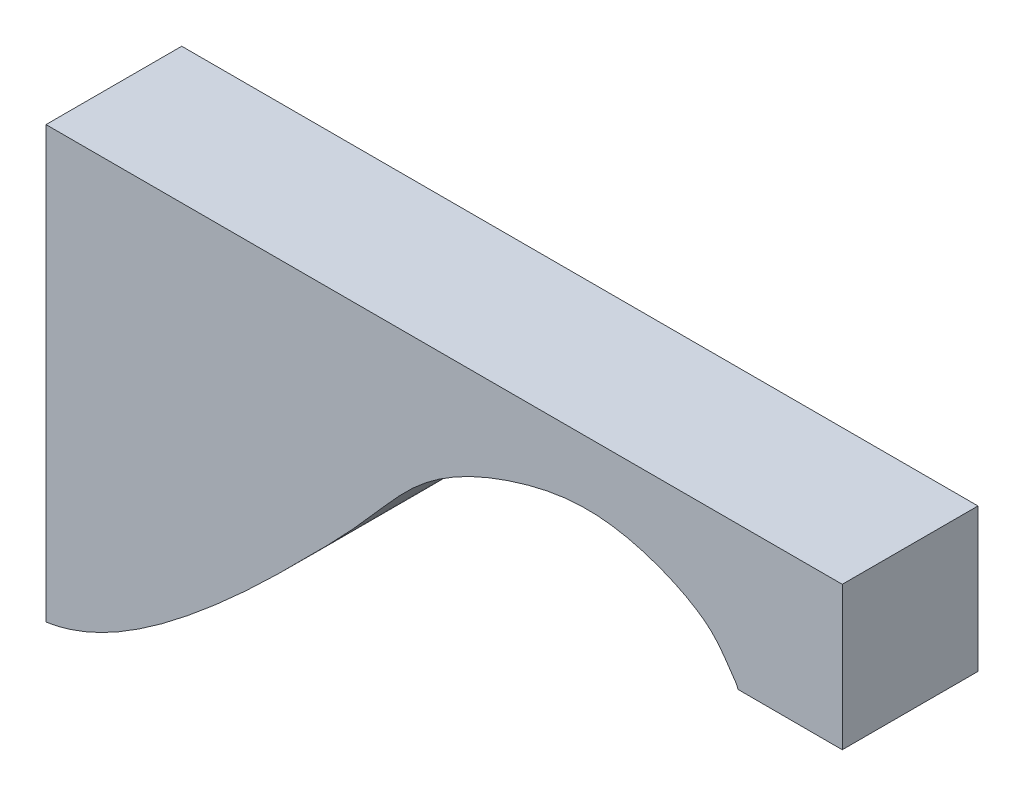
ISO-10303-21;
HEADER;
FILE_DESCRIPTION(('STEP AP214'),'2;1');
FILE_NAME('part.step','',(''),(''),'','','');
FILE_SCHEMA(('AUTOMOTIVE_DESIGN { 1 0 10303 214 1 1 1 1 }'));
ENDSEC;
DATA;
#1=APPLICATION_CONTEXT('core data for automotive mechanical design processes');
#2=APPLICATION_PROTOCOL_DEFINITION('international standard','automotive_design',2000,#1);
#3=PRODUCT_CONTEXT('',#1,'mechanical');
#4=PRODUCT('Part','Part','',(#3));
#5=PRODUCT_RELATED_PRODUCT_CATEGORY('part','',(#4));
#6=PRODUCT_DEFINITION_FORMATION('','',#4);
#7=PRODUCT_DEFINITION_CONTEXT('part definition',#1,'design');
#8=PRODUCT_DEFINITION('design','',#6,#7);
#9=PRODUCT_DEFINITION_SHAPE('','',#8);
#10=(LENGTH_UNIT() NAMED_UNIT(*) SI_UNIT(.MILLI.,.METRE.));
#11=(NAMED_UNIT(*) PLANE_ANGLE_UNIT() SI_UNIT($,.RADIAN.));
#12=(NAMED_UNIT(*) SI_UNIT($,.STERADIAN.) SOLID_ANGLE_UNIT());
#13=UNCERTAINTY_MEASURE_WITH_UNIT(LENGTH_MEASURE(1.E-05),#10,'distance_accuracy_value','');
#14=(GEOMETRIC_REPRESENTATION_CONTEXT(3) GLOBAL_UNCERTAINTY_ASSIGNED_CONTEXT((#13)) GLOBAL_UNIT_ASSIGNED_CONTEXT((#10,
#11,#12)) REPRESENTATION_CONTEXT('',''));
#15=CARTESIAN_POINT('',(0.,0.,0.));
#16=DIRECTION('',(0.,0.,1.));
#17=DIRECTION('',(1.,0.,0.));
#18=AXIS2_PLACEMENT_3D('',#15,#16,#17);
#19=CARTESIAN_POINT('',(56.7695329292914,-23.1398140505859,51.9999999999997));
#20=CARTESIAN_POINT('',(57.285979180506,-23.0612984873367,51.9999999999997));
#21=CARTESIAN_POINT('',(57.7906917341034,-22.9342691366003,51.9999999999997));
#22=CARTESIAN_POINT('',(58.7824079382154,-22.6069917457751,51.9999999999997));
#23=CARTESIAN_POINT('',(59.2715610868895,-22.4055647360326,51.9999999999997));
#24=CARTESIAN_POINT('',(60.6869454004047,-21.7365585192576,51.9999999999997));
#25=CARTESIAN_POINT('',(61.5748041033021,-21.2039869995168,51.9999999999997));
#26=CARTESIAN_POINT('',(63.2942881326894,-20.0514959881764,51.9999999999997));
#27=CARTESIAN_POINT('',(64.1245852304651,-19.4295133431301,51.9999999999997));
#28=CARTESIAN_POINT('',(65.7502012791893,-18.1312160818861,51.9999999999997));
#29=CARTESIAN_POINT('',(66.5441949692823,-17.4560278179111,51.9999999999997));
#30=CARTESIAN_POINT('',(68.100406160835,-16.0757732473001,51.9999999999997));
#31=CARTESIAN_POINT('',(68.863487129066,-15.3693388996823,51.9999999999997));
#32=CARTESIAN_POINT('',(70.3651483770034,-13.9298782471244,51.9999999999997));
#33=CARTESIAN_POINT('',(71.1041151974862,-13.1971682467196,51.9999999999997));
#34=CARTESIAN_POINT('',(72.5741182753382,-11.7235894049574,51.9999999999997));
#35=CARTESIAN_POINT('',(73.3073110471058,-10.9850694251836,51.9999999999997));
#36=CARTESIAN_POINT('',(74.3858546370538,-9.85696251296961,51.9999999999997));
#37=CARTESIAN_POINT('',(74.7413987118715,-9.47712809667723,51.9999999999997));
#38=CARTESIAN_POINT('',(75.4413970209349,-8.7068489308984,51.9999999999997));
#39=CARTESIAN_POINT('',(75.7846823209215,-8.3153028691134,51.9999999999997));
#40=CARTESIAN_POINT('',(76.4698718056331,-7.5304405907173,51.9999999999997));
#41=CARTESIAN_POINT('',(76.811845283095,-7.13734287767223,51.9999999999997));
#42=CARTESIAN_POINT('',(77.509783641773,-6.36615925076295,51.9999999999997));
#43=CARTESIAN_POINT('',(77.8653080005757,-5.98760068711172,51.9999999999997));
#44=CARTESIAN_POINT('',(78.615212628577,-5.27217323827879,51.9999999999997));
#45=CARTESIAN_POINT('',(79.0097185899976,-4.93543921207415,51.9999999999997));
#46=CARTESIAN_POINT('',(79.8430453630222,-4.30951789931776,51.9999999999997));
#47=CARTESIAN_POINT('',(80.2830269569935,-4.01962258671459,51.9999999999997));
#48=CARTESIAN_POINT('',(81.6584729758453,-3.22184863800179,51.9999999999997));
#49=CARTESIAN_POINT('',(82.6165952164924,-2.79714695233828,51.9999999999997));
#50=CARTESIAN_POINT('',(84.0943450583755,-2.26570153619637,51.9999999999997));
#51=CARTESIAN_POINT('',(84.5937610776078,-2.10634079868381,51.9999999999997));
#52=CARTESIAN_POINT('',(85.6073944820156,-1.82615186286361,51.9999999999997));
#53=CARTESIAN_POINT('',(86.1250576878099,-1.7058708877309,51.9999999999997));
#54=CARTESIAN_POINT('',(87.1628454557626,-1.52679968085252,51.9999999999997));
#55=CARTESIAN_POINT('',(87.6832540944095,-1.46763494736214,51.9999999999997));
#56=CARTESIAN_POINT('',(88.7277672876193,-1.42340868917566,51.9999999999997));
#57=CARTESIAN_POINT('',(89.2519096915891,-1.43910604605879,51.9999999999997));
#58=CARTESIAN_POINT('',(90.0411227223575,-1.52279062573416,51.9999999999997));
#59=CARTESIAN_POINT('',(90.304870485113,-1.56047638372769,51.9999999999997));
#60=CARTESIAN_POINT('',(90.8252187981371,-1.6524229929864,51.9999999999997));
#61=CARTESIAN_POINT('',(91.082900662301,-1.70674496130816,51.9999999999997));
#62=CARTESIAN_POINT('',(91.8492054529693,-1.89229115766123,51.9999999999997));
#63=CARTESIAN_POINT('',(92.3511326120563,-2.04594482113714,51.9999999999997));
#64=CARTESIAN_POINT('',(93.3380663288029,-2.40993266187414,51.9999999999997));
#65=CARTESIAN_POINT('',(93.826746040114,-2.61961044580516,51.9999999999997));
#66=CARTESIAN_POINT('',(94.5306680997257,-2.98572934969667,51.9999999999997));
#67=CARTESIAN_POINT('',(94.7603840317825,-3.11553775232475,51.9999999999997));
#68=CARTESIAN_POINT('',(95.2090855200292,-3.39208165536228,51.9999999999997));
#69=CARTESIAN_POINT('',(95.4274347302452,-3.53982098738524,51.9999999999997));
#70=CARTESIAN_POINT('',(95.8446604242783,-3.86601775002373,51.9999999999997));
#71=CARTESIAN_POINT('',(96.0440735507371,-4.04708380208348,51.9999999999997));
#72=CARTESIAN_POINT('',(96.4009155406048,-4.43749852406963,51.9999999999997));
#73=CARTESIAN_POINT('',(96.5609242955925,-4.64701213226887,51.9999999999997));
#74=CARTESIAN_POINT('',(96.8706178134624,-5.07406105507819,51.9999999999997));
#75=CARTESIAN_POINT('',(97.0196620781373,-5.2920940345959,51.9999999999997));
#76=CARTESIAN_POINT('',(97.2482037889488,-5.61527770213673,51.9999999999997));
#77=CARTESIAN_POINT('',(97.3245295361561,-5.72289278933567,51.9999999999997));
#78=CARTESIAN_POINT('',(97.4644226118136,-5.94803621129245,51.9999999999997));
#79=CARTESIAN_POINT('',(97.5231594866917,-6.06343037465567,51.9999999999997));
#80=CARTESIAN_POINT('',(97.5629347464635,-6.1835749360432,51.9999999999997));
#81=B_SPLINE_CURVE_WITH_KNOTS('',3,(#19,#20,#21,#22,#23,#24,#25,#26,#27,#28,#29,#30,#31,#32,#33,
#34,#35,#36,#37,#38,#39,#40,#41,#42,#43,#44,#45,#46,#47,#48,#49,#50,#51,#52,#53,#54,#55,#56,#57,
#58,#59,#60,#61,#62,#63,#64,#65,#66,#67,#68,#69,#70,#71,#72,#73,#74,#75,#76,#77,#78,#79,#80),
.UNSPECIFIED.,.F.,.F.,(4,2,2,2,2,2,2,2,2,2,2,2,2,2,2,2,2,2,2,2,2,2,2,2,2,2,2,2,2,2,4),(0.,
0.0312500000000001,0.0625000000000002,0.125,0.1875,0.250000000000001,0.312500000000001,
0.375000000000001,0.437500000000001,0.468750000000001,0.500000000000001,0.531250000000001,
0.562500000000001,0.593750000000001,0.625000000000001,0.687500000000001,0.718750000000002,
0.750000000000002,0.781250000000003,0.812500000000003,0.828125000000003,0.843750000000003,
0.875000000000003,0.906250000000003,0.921875000000002,0.937500000000002,0.953125000000001,
0.968750000000001,0.984375,0.9921875,1.),.UNSPECIFIED.);
#82=DIRECTION('',(0.,0.,1.));
#83=VECTOR('',#82,1.);
#84=SURFACE_OF_LINEAR_EXTRUSION('',#81,#83);
#85=CARTESIAN_POINT('',(97.5629347464635,-6.1835749360432,59.9999999999997));
#86=CARTESIAN_POINT('',(97.5231594866917,-6.06343037465567,59.9999999999997));
#87=CARTESIAN_POINT('',(97.4644226118136,-5.94803621129245,59.9999999999997));
#88=CARTESIAN_POINT('',(97.3245295361561,-5.72289278933567,59.9999999999997));
#89=CARTESIAN_POINT('',(97.2482037889488,-5.61527770213673,59.9999999999997));
#90=CARTESIAN_POINT('',(97.0196620781373,-5.2920940345959,59.9999999999997));
#91=CARTESIAN_POINT('',(96.8706178134624,-5.07406105507819,59.9999999999997));
#92=CARTESIAN_POINT('',(96.5609242955925,-4.64701213226887,59.9999999999997));
#93=CARTESIAN_POINT('',(96.4009155406048,-4.43749852406963,59.9999999999997));
#94=CARTESIAN_POINT('',(96.0440735507371,-4.04708380208348,59.9999999999997));
#95=CARTESIAN_POINT('',(95.8446604242783,-3.86601775002373,59.9999999999997));
#96=CARTESIAN_POINT('',(95.4274347302452,-3.53982098738524,59.9999999999997));
#97=CARTESIAN_POINT('',(95.2090855200292,-3.39208165536228,59.9999999999997));
#98=CARTESIAN_POINT('',(94.7603840317825,-3.11553775232475,59.9999999999997));
#99=CARTESIAN_POINT('',(94.5306680997257,-2.98572934969667,59.9999999999997));
#100=CARTESIAN_POINT('',(93.826746040114,-2.61961044580516,59.9999999999997));
#101=CARTESIAN_POINT('',(93.3380663288029,-2.40993266187414,59.9999999999997));
#102=CARTESIAN_POINT('',(92.3511326120563,-2.04594482113714,59.9999999999997));
#103=CARTESIAN_POINT('',(91.8492054529693,-1.89229115766123,59.9999999999997));
#104=CARTESIAN_POINT('',(91.082900662301,-1.70674496130816,59.9999999999997));
#105=CARTESIAN_POINT('',(90.8252187981371,-1.6524229929864,59.9999999999997));
#106=CARTESIAN_POINT('',(90.304870485113,-1.56047638372769,59.9999999999997));
#107=CARTESIAN_POINT('',(90.0411227223575,-1.52279062573416,59.9999999999997));
#108=CARTESIAN_POINT('',(89.2519096915891,-1.43910604605879,59.9999999999997));
#109=CARTESIAN_POINT('',(88.7277672876193,-1.42340868917566,59.9999999999997));
#110=CARTESIAN_POINT('',(87.6832540944095,-1.46763494736214,59.9999999999997));
#111=CARTESIAN_POINT('',(87.1628454557626,-1.52679968085252,59.9999999999997));
#112=CARTESIAN_POINT('',(86.1250576878099,-1.7058708877309,59.9999999999997));
#113=CARTESIAN_POINT('',(85.6073944820156,-1.82615186286361,59.9999999999997));
#114=CARTESIAN_POINT('',(84.5937610776078,-2.10634079868381,59.9999999999997));
#115=CARTESIAN_POINT('',(84.0943450583755,-2.26570153619637,59.9999999999997));
#116=CARTESIAN_POINT('',(82.6165952164924,-2.79714695233828,59.9999999999997));
#117=CARTESIAN_POINT('',(81.6584729758453,-3.22184863800179,59.9999999999997));
#118=CARTESIAN_POINT('',(80.2830269569935,-4.01962258671459,59.9999999999997));
#119=CARTESIAN_POINT('',(79.8430453630222,-4.30951789931776,59.9999999999997));
#120=CARTESIAN_POINT('',(79.0097185899976,-4.93543921207415,59.9999999999997));
#121=CARTESIAN_POINT('',(78.615212628577,-5.27217323827879,59.9999999999997));
#122=CARTESIAN_POINT('',(77.8653080005757,-5.98760068711172,59.9999999999997));
#123=CARTESIAN_POINT('',(77.509783641773,-6.36615925076295,59.9999999999997));
#124=CARTESIAN_POINT('',(76.811845283095,-7.13734287767223,59.9999999999997));
#125=CARTESIAN_POINT('',(76.4698718056331,-7.5304405907173,59.9999999999997));
#126=CARTESIAN_POINT('',(75.7846823209215,-8.3153028691134,59.9999999999997));
#127=CARTESIAN_POINT('',(75.4413970209349,-8.7068489308984,59.9999999999997));
#128=CARTESIAN_POINT('',(74.7413987118715,-9.47712809667723,59.9999999999997));
#129=CARTESIAN_POINT('',(74.3858546370538,-9.85696251296961,59.9999999999997));
#130=CARTESIAN_POINT('',(73.3073110471058,-10.9850694251836,59.9999999999997));
#131=CARTESIAN_POINT('',(72.5741182753382,-11.7235894049574,59.9999999999997));
#132=CARTESIAN_POINT('',(71.1041151974862,-13.1971682467196,59.9999999999997));
#133=CARTESIAN_POINT('',(70.3651483770034,-13.9298782471244,59.9999999999997));
#134=CARTESIAN_POINT('',(68.863487129066,-15.3693388996823,59.9999999999997));
#135=CARTESIAN_POINT('',(68.100406160835,-16.0757732473001,59.9999999999997));
#136=CARTESIAN_POINT('',(66.5441949692823,-17.4560278179111,59.9999999999997));
#137=CARTESIAN_POINT('',(65.7502012791893,-18.1312160818861,59.9999999999997));
#138=CARTESIAN_POINT('',(64.1245852304651,-19.4295133431301,59.9999999999997));
#139=CARTESIAN_POINT('',(63.2942881326894,-20.0514959881764,59.9999999999997));
#140=CARTESIAN_POINT('',(61.5748041033021,-21.2039869995168,59.9999999999997));
#141=CARTESIAN_POINT('',(60.6869454004047,-21.7365585192576,59.9999999999997));
#142=CARTESIAN_POINT('',(59.2715610868895,-22.4055647360326,59.9999999999997));
#143=CARTESIAN_POINT('',(58.7824079382154,-22.6069917457751,59.9999999999997));
#144=CARTESIAN_POINT('',(57.7906917341034,-22.9342691366003,59.9999999999997));
#145=CARTESIAN_POINT('',(57.285979180506,-23.0612984873367,59.9999999999997));
#146=CARTESIAN_POINT('',(56.7695329292914,-23.1398140505859,59.9999999999997));
#147=B_SPLINE_CURVE_WITH_KNOTS('',3,(#85,#86,#87,#88,#89,#90,#91,#92,#93,#94,#95,#96,#97,#98,
#99,#100,#101,#102,#103,#104,#105,#106,#107,#108,#109,#110,#111,#112,#113,#114,#115,#116,#117,
#118,#119,#120,#121,#122,#123,#124,#125,#126,#127,#128,#129,#130,#131,#132,#133,#134,#135,#136,
#137,#138,#139,#140,#141,#142,#143,#144,#145,#146),.UNSPECIFIED.,.F.,.F.,(4,2,2,2,2,2,2,2,2,2,2,
2,2,2,2,2,2,2,2,2,2,2,2,2,2,2,2,2,2,2,4),(0.,0.00781249999999989,0.0156249999999999,
0.0312499999999993,0.0468749999999989,0.0624999999999983,0.0781249999999979,0.0937499999999973,
0.124999999999997,0.156249999999997,0.171874999999997,0.187499999999997,0.218749999999997,
0.249999999999998,0.281249999999998,0.312499999999999,0.374999999999999,0.406249999999999,
0.437499999999999,0.468749999999999,0.499999999999999,0.531249999999999,0.562499999999999,
0.624999999999999,0.687499999999999,0.749999999999999,0.8125,0.875,0.9375,0.96875,1.),.UNSPECIFIED.);
#148=CARTESIAN_POINT('',(56.7695329292914,-23.1398140505859,59.9999999999997));
#149=VERTEX_POINT('',#148);
#150=CARTESIAN_POINT('',(97.5629347464635,-6.18357493604319,59.9999999999997));
#151=VERTEX_POINT('',#150);
#152=EDGE_CURVE('E148',#149,#151,#147,.F.);
#153=ORIENTED_EDGE('',*,*,#152,.F.);
#154=DIRECTION('',(0.,0.,1.));
#155=VECTOR('',#154,1.);
#156=CARTESIAN_POINT('',(56.7695329292914,-23.1398140505859,51.9999999999997));
#157=LINE('',#156,#155);
#158=CARTESIAN_POINT('',(56.7695329292914,-23.1398140505859,51.9999999999997));
#159=VERTEX_POINT('',#158);
#160=EDGE_CURVE('E11',#159,#149,#157,.T.);
#161=ORIENTED_EDGE('',*,*,#160,.F.);
#162=CARTESIAN_POINT('',(56.7695329292914,-23.1398140505859,51.9999999999997));
#163=CARTESIAN_POINT('',(57.285979180506,-23.0612984873367,51.9999999999997));
#164=CARTESIAN_POINT('',(57.7906917341034,-22.9342691366003,51.9999999999997));
#165=CARTESIAN_POINT('',(58.7824079382154,-22.6069917457751,51.9999999999997));
#166=CARTESIAN_POINT('',(59.2715610868895,-22.4055647360326,51.9999999999997));
#167=CARTESIAN_POINT('',(60.6869454004047,-21.7365585192576,51.9999999999997));
#168=CARTESIAN_POINT('',(61.5748041033021,-21.2039869995168,51.9999999999997));
#169=CARTESIAN_POINT('',(63.2942881326894,-20.0514959881764,51.9999999999997));
#170=CARTESIAN_POINT('',(64.1245852304651,-19.4295133431301,51.9999999999997));
#171=CARTESIAN_POINT('',(65.7502012791893,-18.1312160818861,51.9999999999997));
#172=CARTESIAN_POINT('',(66.5441949692823,-17.4560278179111,51.9999999999997));
#173=CARTESIAN_POINT('',(68.100406160835,-16.0757732473001,51.9999999999997));
#174=CARTESIAN_POINT('',(68.863487129066,-15.3693388996823,51.9999999999997));
#175=CARTESIAN_POINT('',(70.3651483770034,-13.9298782471244,51.9999999999997));
#176=CARTESIAN_POINT('',(71.1041151974862,-13.1971682467196,51.9999999999997));
#177=CARTESIAN_POINT('',(72.5741182753382,-11.7235894049574,51.9999999999997));
#178=CARTESIAN_POINT('',(73.3073110471058,-10.9850694251836,51.9999999999997));
#179=CARTESIAN_POINT('',(74.3858546370538,-9.85696251296961,51.9999999999997));
#180=CARTESIAN_POINT('',(74.7413987118715,-9.47712809667723,51.9999999999997));
#181=CARTESIAN_POINT('',(75.4413970209349,-8.7068489308984,51.9999999999997));
#182=CARTESIAN_POINT('',(75.7846823209215,-8.3153028691134,51.9999999999997));
#183=CARTESIAN_POINT('',(76.4698718056331,-7.5304405907173,51.9999999999997));
#184=CARTESIAN_POINT('',(76.811845283095,-7.13734287767223,51.9999999999997));
#185=CARTESIAN_POINT('',(77.509783641773,-6.36615925076295,51.9999999999997));
#186=CARTESIAN_POINT('',(77.8653080005757,-5.98760068711172,51.9999999999997));
#187=CARTESIAN_POINT('',(78.615212628577,-5.27217323827879,51.9999999999997));
#188=CARTESIAN_POINT('',(79.0097185899976,-4.93543921207415,51.9999999999997));
#189=CARTESIAN_POINT('',(79.8430453630222,-4.30951789931776,51.9999999999997));
#190=CARTESIAN_POINT('',(80.2830269569935,-4.01962258671459,51.9999999999997));
#191=CARTESIAN_POINT('',(81.6584729758453,-3.22184863800179,51.9999999999997));
#192=CARTESIAN_POINT('',(82.6165952164924,-2.79714695233828,51.9999999999997));
#193=CARTESIAN_POINT('',(84.0943450583755,-2.26570153619637,51.9999999999997));
#194=CARTESIAN_POINT('',(84.5937610776078,-2.10634079868381,51.9999999999997));
#195=CARTESIAN_POINT('',(85.6073944820156,-1.82615186286361,51.9999999999997));
#196=CARTESIAN_POINT('',(86.1250576878099,-1.7058708877309,51.9999999999997));
#197=CARTESIAN_POINT('',(87.1628454557626,-1.52679968085252,51.9999999999997));
#198=CARTESIAN_POINT('',(87.6832540944095,-1.46763494736214,51.9999999999997));
#199=CARTESIAN_POINT('',(88.7277672876193,-1.42340868917566,51.9999999999997));
#200=CARTESIAN_POINT('',(89.2519096915891,-1.43910604605879,51.9999999999997));
#201=CARTESIAN_POINT('',(90.0411227223575,-1.52279062573416,51.9999999999997));
#202=CARTESIAN_POINT('',(90.304870485113,-1.56047638372769,51.9999999999997));
#203=CARTESIAN_POINT('',(90.8252187981371,-1.6524229929864,51.9999999999997));
#204=CARTESIAN_POINT('',(91.082900662301,-1.70674496130816,51.9999999999997));
#205=CARTESIAN_POINT('',(91.8492054529693,-1.89229115766123,51.9999999999997));
#206=CARTESIAN_POINT('',(92.3511326120563,-2.04594482113714,51.9999999999997));
#207=CARTESIAN_POINT('',(93.3380663288029,-2.40993266187414,51.9999999999997));
#208=CARTESIAN_POINT('',(93.826746040114,-2.61961044580516,51.9999999999997));
#209=CARTESIAN_POINT('',(94.5306680997257,-2.98572934969667,51.9999999999997));
#210=CARTESIAN_POINT('',(94.7603840317825,-3.11553775232475,51.9999999999997));
#211=CARTESIAN_POINT('',(95.2090855200292,-3.39208165536228,51.9999999999997));
#212=CARTESIAN_POINT('',(95.4274347302452,-3.53982098738524,51.9999999999997));
#213=CARTESIAN_POINT('',(95.8446604242783,-3.86601775002373,51.9999999999997));
#214=CARTESIAN_POINT('',(96.0440735507371,-4.04708380208348,51.9999999999997));
#215=CARTESIAN_POINT('',(96.4009155406048,-4.43749852406963,51.9999999999997));
#216=CARTESIAN_POINT('',(96.5609242955925,-4.64701213226887,51.9999999999997));
#217=CARTESIAN_POINT('',(96.8706178134624,-5.07406105507819,51.9999999999997));
#218=CARTESIAN_POINT('',(97.0196620781373,-5.2920940345959,51.9999999999997));
#219=CARTESIAN_POINT('',(97.2482037889488,-5.61527770213673,51.9999999999997));
#220=CARTESIAN_POINT('',(97.3245295361561,-5.72289278933567,51.9999999999997));
#221=CARTESIAN_POINT('',(97.4644226118136,-5.94803621129245,51.9999999999997));
#222=CARTESIAN_POINT('',(97.5231594866917,-6.06343037465567,51.9999999999997));
#223=CARTESIAN_POINT('',(97.5629347464635,-6.1835749360432,51.9999999999997));
#224=B_SPLINE_CURVE_WITH_KNOTS('',3,(#162,#163,#164,#165,#166,#167,#168,#169,#170,#171,#172,
#173,#174,#175,#176,#177,#178,#179,#180,#181,#182,#183,#184,#185,#186,#187,#188,#189,#190,#191,
#192,#193,#194,#195,#196,#197,#198,#199,#200,#201,#202,#203,#204,#205,#206,#207,#208,#209,#210,
#211,#212,#213,#214,#215,#216,#217,#218,#219,#220,#221,#222,#223),.UNSPECIFIED.,.F.,.F.,(4,2,2,
2,2,2,2,2,2,2,2,2,2,2,2,2,2,2,2,2,2,2,2,2,2,2,2,2,2,2,4),(0.,0.0312500000000001,
0.0625000000000002,0.125,0.1875,0.250000000000001,0.312500000000001,0.375000000000001,
0.437500000000001,0.468750000000001,0.500000000000001,0.531250000000001,0.562500000000001,
0.593750000000001,0.625000000000001,0.687500000000001,0.718750000000002,0.750000000000002,
0.781250000000003,0.812500000000003,0.828125000000003,0.843750000000003,0.875000000000003,
0.906250000000003,0.921875000000002,0.937500000000002,0.953125000000001,0.968750000000001,
0.984375,0.9921875,1.),.UNSPECIFIED.);
#225=CARTESIAN_POINT('',(97.5629347464635,-6.18357493604319,51.9999999999997));
#226=VERTEX_POINT('',#225);
#227=EDGE_CURVE('E105',#159,#226,#224,.T.);
#228=ORIENTED_EDGE('',*,*,#227,.T.);
#229=DIRECTION('',(0.,0.,1.));
#230=VECTOR('',#229,1.);
#231=CARTESIAN_POINT('',(97.5629347464635,-6.18357493604319,51.9999999999997));
#232=LINE('',#231,#230);
#233=EDGE_CURVE('E79',#226,#151,#232,.T.);
#234=ORIENTED_EDGE('',*,*,#233,.T.);
#235=EDGE_LOOP('',(#153,#161,#228,#234));
#236=FACE_BOUND('',#235,.T.);
#237=ADVANCED_FACE('F30',(#236),#84,.T.);
#238=CARTESIAN_POINT('',(56.7695335011799,2.25600000000003,51.9999999999997));
#239=DIRECTION('',(-1.,2.25190051399342E-08,0.));
#240=DIRECTION('',(-2.25190051399342E-08,-1.,0.));
#241=AXIS2_PLACEMENT_3D('',#238,#239,#240);
#242=PLANE('',#241);
#243=DIRECTION('',(-2.25190051399342E-08,-1.,0.));
#244=VECTOR('',#243,1.);
#245=CARTESIAN_POINT('',(56.7695335011799,2.25600000000003,59.9999999999997));
#246=LINE('',#245,#244);
#247=CARTESIAN_POINT('',(56.7695335011799,2.25600000000003,59.9999999999997));
#248=VERTEX_POINT('',#247);
#249=EDGE_CURVE('E152',#248,#149,#246,.T.);
#250=ORIENTED_EDGE('',*,*,#249,.F.);
#251=DIRECTION('',(0.,0.,1.));
#252=VECTOR('',#251,1.);
#253=CARTESIAN_POINT('',(56.7695335011799,2.25600000000003,51.9999999999997));
#254=LINE('',#253,#252);
#255=CARTESIAN_POINT('',(56.7695335011799,2.25600000000003,51.9999999999997));
#256=VERTEX_POINT('',#255);
#257=EDGE_CURVE('E41',#256,#248,#254,.T.);
#258=ORIENTED_EDGE('',*,*,#257,.F.);
#259=DIRECTION('',(-2.25190051399342E-08,-1.,0.));
#260=VECTOR('',#259,1.);
#261=CARTESIAN_POINT('',(56.7695335011799,2.25600000000003,51.9999999999997));
#262=LINE('',#261,#260);
#263=EDGE_CURVE('E100',#256,#159,#262,.T.);
#264=ORIENTED_EDGE('',*,*,#263,.T.);
#265=ORIENTED_EDGE('',*,*,#160,.T.);
#266=EDGE_LOOP('',(#250,#258,#264,#265));
#267=FACE_BOUND('',#266,.T.);
#268=ADVANCED_FACE('F133',(#267),#242,.T.);
#269=CARTESIAN_POINT('',(103.702818864967,2.25600000000003,51.9999999999997));
#270=DIRECTION('',(0.,1.,0.));
#271=DIRECTION('',(-1.,0.,0.));
#272=AXIS2_PLACEMENT_3D('',#269,#270,#271);
#273=PLANE('',#272);
#274=DIRECTION('',(-1.,0.,0.));
#275=VECTOR('',#274,1.);
#276=CARTESIAN_POINT('',(103.702818864967,2.25600000000003,59.9999999999997));
#277=LINE('',#276,#275);
#278=CARTESIAN_POINT('',(103.702818864967,2.25600000000003,59.9999999999997));
#279=VERTEX_POINT('',#278);
#280=EDGE_CURVE('E89',#279,#248,#277,.T.);
#281=ORIENTED_EDGE('',*,*,#280,.F.);
#282=DIRECTION('',(0.,0.,1.));
#283=VECTOR('',#282,1.);
#284=CARTESIAN_POINT('',(103.702818864967,2.25600000000003,51.9999999999997));
#285=LINE('',#284,#283);
#286=CARTESIAN_POINT('',(103.702818864967,2.25600000000003,51.9999999999997));
#287=VERTEX_POINT('',#286);
#288=EDGE_CURVE('E84',#287,#279,#285,.T.);
#289=ORIENTED_EDGE('',*,*,#288,.F.);
#290=DIRECTION('',(-1.,0.,0.));
#291=VECTOR('',#290,1.);
#292=CARTESIAN_POINT('',(103.702818864967,2.25600000000003,51.9999999999997));
#293=LINE('',#292,#291);
#294=EDGE_CURVE('E87',#287,#256,#293,.T.);
#295=ORIENTED_EDGE('',*,*,#294,.T.);
#296=ORIENTED_EDGE('',*,*,#257,.T.);
#297=EDGE_LOOP('',(#281,#289,#295,#296));
#298=FACE_BOUND('',#297,.T.);
#299=ADVANCED_FACE('F86',(#298),#273,.T.);
#300=CARTESIAN_POINT('',(103.703011246893,-6.19124656794307,51.9999999999997));
#301=DIRECTION('',(0.999999999740661,2.27745128579865E-05,0.));
#302=DIRECTION('',(-2.27745128579865E-05,0.999999999740661,0.));
#303=AXIS2_PLACEMENT_3D('',#300,#301,#302);
#304=PLANE('',#303);
#305=DIRECTION('',(-2.27745128579865E-05,0.999999999740661,0.));
#306=VECTOR('',#305,1.);
#307=CARTESIAN_POINT('',(103.703011246893,-6.19124656794307,59.9999999999997));
#308=LINE('',#307,#306);
#309=CARTESIAN_POINT('',(103.703011246893,-6.19124656794307,59.9999999999997));
#310=VERTEX_POINT('',#309);
#311=EDGE_CURVE('E158',#310,#279,#308,.T.);
#312=ORIENTED_EDGE('',*,*,#311,.F.);
#313=DIRECTION('',(0.,0.,1.));
#314=VECTOR('',#313,1.);
#315=CARTESIAN_POINT('',(103.703011246893,-6.19124656794307,51.9999999999997));
#316=LINE('',#315,#314);
#317=CARTESIAN_POINT('',(103.703011246893,-6.19124656794307,51.9999999999997));
#318=VERTEX_POINT('',#317);
#319=EDGE_CURVE('E94',#318,#310,#316,.T.);
#320=ORIENTED_EDGE('',*,*,#319,.F.);
#321=DIRECTION('',(-2.27745128579865E-05,0.999999999740661,0.));
#322=VECTOR('',#321,1.);
#323=CARTESIAN_POINT('',(103.703011246893,-6.19124656794307,51.9999999999997));
#324=LINE('',#323,#322);
#325=EDGE_CURVE('E99',#318,#287,#324,.T.);
#326=ORIENTED_EDGE('',*,*,#325,.T.);
#327=ORIENTED_EDGE('',*,*,#288,.T.);
#328=EDGE_LOOP('',(#312,#320,#326,#327));
#329=FACE_BOUND('',#328,.T.);
#330=ADVANCED_FACE('F102',(#329),#304,.T.);
#331=CARTESIAN_POINT('',(97.5629347464635,-6.18357493604319,51.9999999999997));
#332=CARTESIAN_POINT('',(99.6096268660921,-6.18616963388078,51.9999999999997));
#333=CARTESIAN_POINT('',(101.65631903546,-6.18872532506412,51.9999999999997));
#334=CARTESIAN_POINT('',(103.703011246893,-6.19124656794307,51.9999999999997));
#335=B_SPLINE_CURVE_WITH_KNOTS('',3,(#331,#332,#333,#334),.UNSPECIFIED.,.F.,.F.,(4,4),(0.,1.),.UNSPECIFIED.);
#336=DIRECTION('',(0.,0.,1.));
#337=VECTOR('',#336,1.);
#338=SURFACE_OF_LINEAR_EXTRUSION('',#335,#337);
#339=CARTESIAN_POINT('',(103.703011246893,-6.19124656794307,59.9999999999997));
#340=CARTESIAN_POINT('',(101.65631903546,-6.18872532506412,59.9999999999997));
#341=CARTESIAN_POINT('',(99.6096268660921,-6.18616963388078,59.9999999999997));
#342=CARTESIAN_POINT('',(97.5629347464635,-6.18357493604319,59.9999999999997));
#343=B_SPLINE_CURVE_WITH_KNOTS('',3,(#339,#340,#341,#342),.UNSPECIFIED.,.F.,.F.,(4,4),(0.,1.),.UNSPECIFIED.);
#344=EDGE_CURVE('E116',#151,#310,#343,.F.);
#345=ORIENTED_EDGE('',*,*,#344,.F.);
#346=ORIENTED_EDGE('',*,*,#233,.F.);
#347=CARTESIAN_POINT('',(97.5629347464635,-6.18357493604319,51.9999999999997));
#348=CARTESIAN_POINT('',(99.6096268660921,-6.18616963388078,51.9999999999997));
#349=CARTESIAN_POINT('',(101.65631903546,-6.18872532506412,51.9999999999997));
#350=CARTESIAN_POINT('',(103.703011246893,-6.19124656794307,51.9999999999997));
#351=B_SPLINE_CURVE_WITH_KNOTS('',3,(#347,#348,#349,#350),.UNSPECIFIED.,.F.,.F.,(4,4),(0.,1.),.UNSPECIFIED.);
#352=EDGE_CURVE('E103',#226,#318,#351,.T.);
#353=ORIENTED_EDGE('',*,*,#352,.T.);
#354=ORIENTED_EDGE('',*,*,#319,.T.);
#355=EDGE_LOOP('',(#345,#346,#353,#354));
#356=FACE_BOUND('',#355,.T.);
#357=ADVANCED_FACE('F169',(#356),#338,.T.);
#358=CARTESIAN_POINT('',(76.1272770632773,-7.92287172991539,51.9999999999997));
#359=DIRECTION('',(0.,0.,-1.));
#360=DIRECTION('',(-1.,0.,0.));
#361=AXIS2_PLACEMENT_3D('',#358,#359,#360);
#362=PLANE('',#361);
#363=ORIENTED_EDGE('',*,*,#227,.F.);
#364=ORIENTED_EDGE('',*,*,#263,.F.);
#365=ORIENTED_EDGE('',*,*,#294,.F.);
#366=ORIENTED_EDGE('',*,*,#325,.F.);
#367=ORIENTED_EDGE('',*,*,#352,.F.);
#368=EDGE_LOOP('',(#363,#364,#365,#366,#367));
#369=FACE_BOUND('',#368,.T.);
#370=ADVANCED_FACE('F98',(#369),#362,.T.);
#371=CARTESIAN_POINT('',(76.1272770632773,-7.92287172991539,59.9999999999997));
#372=DIRECTION('',(0.,0.,-1.));
#373=DIRECTION('',(-1.,0.,0.));
#374=AXIS2_PLACEMENT_3D('',#371,#372,#373);
#375=PLANE('',#374);
#376=ORIENTED_EDGE('',*,*,#152,.T.);
#377=ORIENTED_EDGE('',*,*,#344,.T.);
#378=ORIENTED_EDGE('',*,*,#311,.T.);
#379=ORIENTED_EDGE('',*,*,#280,.T.);
#380=ORIENTED_EDGE('',*,*,#249,.T.);
#381=EDGE_LOOP('',(#376,#377,#378,#379,#380));
#382=FACE_BOUND('',#381,.T.);
#383=ADVANCED_FACE('F122',(#382),#375,.F.);
#384=CLOSED_SHELL('',(#237,#268,#299,#330,#357,#370,#383));
#385=MANIFOLD_SOLID_BREP('B2',#384);
#386=ADVANCED_BREP_SHAPE_REPRESENTATION('',(#18,#385),#14);
#387=SHAPE_DEFINITION_REPRESENTATION(#9,#386);
ENDSEC;
END-ISO-10303-21;
